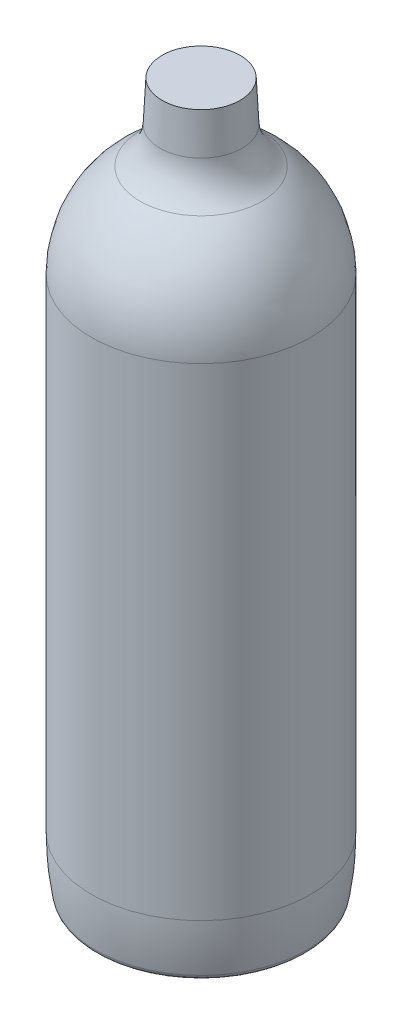
ISO-10303-21;
HEADER;
FILE_DESCRIPTION(('STEP AP214'),'2;1');
FILE_NAME('part.step','',(''),(''),'','','');
FILE_SCHEMA(('AUTOMOTIVE_DESIGN { 1 0 10303 214 1 1 1 1 }'));
ENDSEC;
DATA;
#1=APPLICATION_CONTEXT('core data for automotive mechanical design processes');
#2=APPLICATION_PROTOCOL_DEFINITION('international standard','automotive_design',2000,#1);
#3=PRODUCT_CONTEXT('',#1,'mechanical');
#4=PRODUCT('Part','Part','',(#3));
#5=PRODUCT_RELATED_PRODUCT_CATEGORY('part','',(#4));
#6=PRODUCT_DEFINITION_FORMATION('','',#4);
#7=PRODUCT_DEFINITION_CONTEXT('part definition',#1,'design');
#8=PRODUCT_DEFINITION('design','',#6,#7);
#9=PRODUCT_DEFINITION_SHAPE('','',#8);
#10=(LENGTH_UNIT() NAMED_UNIT(*) SI_UNIT(.MILLI.,.METRE.));
#11=(NAMED_UNIT(*) PLANE_ANGLE_UNIT() SI_UNIT($,.RADIAN.));
#12=(NAMED_UNIT(*) SI_UNIT($,.STERADIAN.) SOLID_ANGLE_UNIT());
#13=UNCERTAINTY_MEASURE_WITH_UNIT(LENGTH_MEASURE(1.E-05),#10,'distance_accuracy_value','');
#14=(GEOMETRIC_REPRESENTATION_CONTEXT(3) GLOBAL_UNCERTAINTY_ASSIGNED_CONTEXT((#13)) GLOBAL_UNIT_ASSIGNED_CONTEXT((#10,
#11,#12)) REPRESENTATION_CONTEXT('',''));
#15=CARTESIAN_POINT('',(0.,0.,0.));
#16=DIRECTION('',(0.,0.,1.));
#17=DIRECTION('',(1.,0.,0.));
#18=AXIS2_PLACEMENT_3D('',#15,#16,#17);
#19=CARTESIAN_POINT('',(-12.618810270685,231.,0.));
#20=DIRECTION('',(0.,-1.,0.));
#21=DIRECTION('',(0.,0.,-1.));
#22=AXIS2_PLACEMENT_3D('',#19,#20,#21);
#23=PLANE('',#22);
#24=CARTESIAN_POINT('',(0.,231.,0.));
#25=DIRECTION('',(0.,-1.,0.));
#26=DIRECTION('',(0.,0.,-1.));
#27=AXIS2_PLACEMENT_3D('',#24,#25,#26);
#28=CIRCLE('',#27,12.6188102706876);
#29=CARTESIAN_POINT('',(0.,231.,-12.6188102706876));
#30=VERTEX_POINT('',#29);
#31=EDGE_CURVE('E61',#30,#30,#28,.T.);
#32=ORIENTED_EDGE('',*,*,#31,.F.);
#33=EDGE_LOOP('',(#32));
#34=FACE_BOUND('',#33,.T.);
#35=ADVANCED_FACE('F30',(#34),#23,.F.);
#36=CARTESIAN_POINT('',(-2.00000000000001,9.93743884534262,0.));
#37=DIRECTION('',(0.,1.,0.));
#38=DIRECTION('',(0.,0.,1.));
#39=AXIS2_PLACEMENT_3D('',#36,#37,#38);
#40=PLANE('',#39);
#41=CARTESIAN_POINT('',(0.,9.93743884534262,0.));
#42=DIRECTION('',(0.,-1.,0.));
#43=DIRECTION('',(0.,0.,-1.));
#44=AXIS2_PLACEMENT_3D('',#41,#42,#43);
#45=CIRCLE('',#44,2.00000000000001);
#46=CARTESIAN_POINT('',(-1.99999999999999,9.93743884534263,0.));
#47=VERTEX_POINT('',#46);
#48=EDGE_CURVE('E10',#47,#47,#45,.T.);
#49=ORIENTED_EDGE('',*,*,#48,.T.);
#50=EDGE_LOOP('',(#49));
#51=FACE_BOUND('',#50,.T.);
#52=ADVANCED_FACE('F68',(#51),#40,.F.);
#53=CARTESIAN_POINT('',(0.,-22.,0.));
#54=DIRECTION('',(0.,-1.,0.));
#55=DIRECTION('',(-1.,0.,0.));
#56=AXIS2_PLACEMENT_3D('',#53,#54,#55);
#57=SPHERICAL_SURFACE('',#56,32.);
#58=CARTESIAN_POINT('',(0.,8.69573486026913,0.));
#59=DIRECTION('',(0.,-1.,0.));
#60=DIRECTION('',(0.,0.,-1.));
#61=AXIS2_PLACEMENT_3D('',#58,#59,#60);
#62=CIRCLE('',#61,9.04277951672265);
#63=CARTESIAN_POINT('',(-9.04277951672264,8.69573486026913,0.));
#64=VERTEX_POINT('',#63);
#65=EDGE_CURVE('E36',#64,#64,#62,.T.);
#66=CARTESIAN_POINT('',(-1.99999999999999,9.93743884534263,0.));
#67=CARTESIAN_POINT('',(-2.0745037428734,9.93277324458954,0.));
#68=CARTESIAN_POINT('',(-2.14899115922238,9.9278469310397,0.));
#69=CARTESIAN_POINT('',(-2.29792969206511,9.9174731397563,0.));
#70=CARTESIAN_POINT('',(-2.37238080855886,9.91202566202274,0.));
#71=CARTESIAN_POINT('',(-2.52124309488477,9.90060980378172,0.));
#72=CARTESIAN_POINT('',(-2.59565426471693,9.89464142327424,0.));
#73=CARTESIAN_POINT('',(-2.74443301334618,9.88218405324716,0.));
#74=CARTESIAN_POINT('',(-2.81880059214325,9.87569506372756,0.));
#75=CARTESIAN_POINT('',(-2.96748851633618,9.86219679310352,0.));
#76=CARTESIAN_POINT('',(-3.04180886173202,9.85518751199909,0.));
#77=CARTESIAN_POINT('',(-3.19039867910388,9.84064900160633,0.));
#78=CARTESIAN_POINT('',(-3.26466815107989,9.83311977231801,0.));
#79=CARTESIAN_POINT('',(-3.41315258407602,9.81754173429261,0.));
#80=CARTESIAN_POINT('',(-3.48736754509612,9.80949292555553,0.));
#81=CARTESIAN_POINT('',(-3.63573932131659,9.79287612285072,0.));
#82=CARTESIAN_POINT('',(-3.70989613651695,9.78430812888298,0.));
#83=CARTESIAN_POINT('',(-3.8581479890813,9.7666533753539,0.));
#84=CARTESIAN_POINT('',(-3.93224302644528,9.75756661579256,0.));
#85=CARTESIAN_POINT('',(-4.08036769434611,9.73887477612372,0.));
#86=CARTESIAN_POINT('',(-4.15439732488296,9.72926969601621,0.));
#87=CARTESIAN_POINT('',(-4.3023875533422,9.70954168568784,0.));
#88=CARTESIAN_POINT('',(-4.37634815126459,9.69941875546697,0.));
#89=CARTESIAN_POINT('',(-4.52419669208866,9.67865554070788,0.));
#90=CARTESIAN_POINT('',(-4.59808463499033,9.66801525616965,0.));
#91=CARTESIAN_POINT('',(-4.74578424692513,9.64621785391052,0.));
#92=CARTESIAN_POINT('',(-4.81959591595826,9.63506073618962,0.));
#93=CARTESIAN_POINT('',(-4.96713936504387,9.61223021401304,0.));
#94=CARTESIAN_POINT('',(-5.04087114509636,9.60055680955737,0.));
#95=CARTESIAN_POINT('',(-5.18825120502136,9.57669428564558,0.));
#96=CARTESIAN_POINT('',(-5.26189948489387,9.56450516618947,0.));
#97=CARTESIAN_POINT('',(-5.40910893734919,9.53961180926958,0.));
#98=CARTESIAN_POINT('',(-5.482670109932,9.5269075718058,0.));
#99=CARTESIAN_POINT('',(-5.62970174496452,9.50098460109257,0.));
#100=CARTESIAN_POINT('',(-5.70317220741423,9.48776586784311,0.));
#101=CARTESIAN_POINT('',(-5.85001882377989,9.46081455297922,0.));
#102=CARTESIAN_POINT('',(-5.92339497769584,9.44708197136478,0.));
#103=CARTESIAN_POINT('',(-6.07004938321232,9.41910363235864,0.));
#104=CARTESIAN_POINT('',(-6.14332763481286,9.40485787496693,0.));
#105=CARTESIAN_POINT('',(-6.28978264671186,9.37585388212806,0.));
#106=CARTESIAN_POINT('',(-6.36295940701034,9.36109564668088,0.));
#107=CARTESIAN_POINT('',(-6.50920785228937,9.33106742055275,0.));
#108=CARTESIAN_POINT('',(-6.58227953726993,9.3157974298718,0.));
#109=CARTESIAN_POINT('',(-6.72831425304362,9.28474644116232,0.));
#110=CARTESIAN_POINT('',(-6.80127728383674,9.26896544313379,0.));
#111=CARTESIAN_POINT('',(-6.94709111768762,9.23689321264317,0.));
#112=CARTESIAN_POINT('',(-7.01994192074538,9.22060198018109,0.));
#113=CARTESIAN_POINT('',(-7.1655277310743,9.18751007872759,0.));
#114=CARTESIAN_POINT('',(-7.23826273834546,9.17070940973617,0.));
#115=CARTESIAN_POINT('',(-7.38361339472115,9.1365994580785,0.));
#116=CARTESIAN_POINT('',(-7.45622904382568,9.11929017541225,0.));
#117=CARTESIAN_POINT('',(-7.60133742733463,9.08416384417246,0.));
#118=CARTESIAN_POINT('',(-7.67383016173905,9.06634679559894,0.));
#119=CARTESIAN_POINT('',(-7.81868916533177,9.0302058051722,0.));
#120=CARTESIAN_POINT('',(-7.89105543452006,9.01188186331899,0.));
#121=CARTESIAN_POINT('',(-8.0356579633682,8.97472798382079,0.));
#122=CARTESIAN_POINT('',(-8.10789422302805,8.95589804617581,0.));
#123=CARTESIAN_POINT('',(-8.25223319483811,8.91773309723765,0.));
#124=CARTESIAN_POINT('',(-8.32433590698833,8.89839808594446,0.));
#125=CARTESIAN_POINT('',(-8.46840425247461,8.85922393706384,0.));
#126=CARTESIAN_POINT('',(-8.54036988581067,8.83938479947641,0.));
#127=CARTESIAN_POINT('',(-8.68416054857106,8.79920336828631,0.));
#128=CARTESIAN_POINT('',(-8.75598557799539,8.77886107468364,0.));
#129=CARTESIAN_POINT('',(-8.89949151661257,8.73767433297544,0.));
#130=CARTESIAN_POINT('',(-8.97117242580542,8.71682988486991,0.));
#131=CARTESIAN_POINT('',(-9.04277951672264,8.69573486026913,0.));
#132=B_SPLINE_CURVE_WITH_KNOTS('',3,(#66,#67,#68,#69,#70,#71,#72,#73,#74,#75,#76,#77,#78,#79,
#80,#81,#82,#83,#84,#85,#86,#87,#88,#89,#90,#91,#92,#93,#94,#95,#96,#97,#98,#99,#100,#101,#102,
#103,#104,#105,#106,#107,#108,#109,#110,#111,#112,#113,#114,#115,#116,#117,#118,#119,#120,#121,
#122,#123,#124,#125,#126,#127,#128,#129,#130,#131),.UNSPECIFIED.,.F.,.F.,(4,2,2,2,2,2,2,2,2,2,2,
2,2,2,2,2,2,2,2,2,2,2,2,2,2,2,2,2,2,2,2,2,4),(0.,0.223948599129949,0.447897198259898,
0.671845797389847,0.895794396519796,1.11974299564975,1.3436915947797,1.56764019390965,
1.7915887930396,2.01553739216955,2.2394859912995,2.46343459042944,2.6873831895594,
2.91133178868935,3.1352803878193,3.35922898694925,3.5831775860792,3.80712618520915,
4.03107478433909,4.25502338346904,4.47897198259899,4.70292058172895,4.9268691808589,
5.15081777998884,5.37476637911879,5.59871497824874,5.82266357737869,6.04661217650864,
6.2705607756386,6.49450937476854,6.71845797389849,6.94240657302844,7.16635517215839),.UNSPECIFIED.);
#133=EDGE_CURVE('BSEAM72',#47,#64,#132,.T.);
#134=ORIENTED_EDGE('',*,*,#48,.F.);
#135=ORIENTED_EDGE('',*,*,#65,.T.);
#136=ORIENTED_EDGE('',*,*,#133,.T.);
#137=ORIENTED_EDGE('',*,*,#133,.F.);
#138=EDGE_LOOP('',(#134,#136,#135,#137));
#139=FACE_BOUND('',#138,.T.);
#140=ADVANCED_FACE('F72',(#139),#57,.F.);
#141=CARTESIAN_POINT('',(0.,2.08151657123318,0.));
#142=DIRECTION('',(0.,-1.,0.));
#143=DIRECTION('',(0.,0.,-1.));
#144=AXIS2_PLACEMENT_3D('',#141,#142,#143);
#145=CONICAL_SURFACE('',#144,31.4947579745335,1.28430650884736);
#146=ORIENTED_EDGE('',*,*,#65,.F.);
#147=EDGE_LOOP('',(#146));
#148=FACE_BOUND('',#147,.T.);
#149=CARTESIAN_POINT('',(0.,2.08151657123318,0.));
#150=DIRECTION('',(0.,-1.,0.));
#151=DIRECTION('',(0.,0.,-1.));
#152=AXIS2_PLACEMENT_3D('',#149,#150,#151);
#153=CIRCLE('',#152,31.4947579745335);
#154=CARTESIAN_POINT('',(0.,2.08151657123318,-31.4947579745335));
#155=VERTEX_POINT('',#154);
#156=EDGE_CURVE('E40',#155,#155,#153,.T.);
#157=ORIENTED_EDGE('',*,*,#156,.T.);
#158=EDGE_LOOP('',(#157));
#159=FACE_BOUND('',#158,.T.);
#160=ADVANCED_FACE('F76',(#148,#159),#145,.F.);
#161=CARTESIAN_POINT('',(0.,4.,0.));
#162=DIRECTION('',(0.,-1.,0.));
#163=DIRECTION('',(0.,0.,-1.));
#164=AXIS2_PLACEMENT_3D('',#161,#162,#163);
#165=TOROIDAL_SURFACE('',#164,32.0599316943287,2.);
#166=ORIENTED_EDGE('',*,*,#156,.F.);
#167=EDGE_LOOP('',(#166));
#168=FACE_BOUND('',#167,.T.);
#169=CARTESIAN_POINT('',(0.,3.65508633448191,0.));
#170=DIRECTION('',(0.,-1.,0.));
#171=DIRECTION('',(0.,0.,-1.));
#172=AXIS2_PLACEMENT_3D('',#169,#170,#171);
#173=CIRCLE('',#172,34.0299658471643);
#174=CARTESIAN_POINT('',(0.,3.65508633448191,-34.0299658471643));
#175=VERTEX_POINT('',#174);
#176=EDGE_CURVE('E44',#175,#175,#173,.T.);
#177=ORIENTED_EDGE('',*,*,#176,.T.);
#178=EDGE_LOOP('',(#177));
#179=FACE_BOUND('',#178,.T.);
#180=ADVANCED_FACE('F82',(#168,#179),#165,.T.);
#181=CARTESIAN_POINT('',(0.,20.,0.));
#182=DIRECTION('',(0.,-1.,0.));
#183=DIRECTION('',(0.,0.,-1.));
#184=AXIS2_PLACEMENT_3D('',#181,#182,#183);
#185=DEGENERATE_TOROIDAL_SURFACE('',#184,59.3268401171732,94.7768401171732,.F.);
#186=ORIENTED_EDGE('',*,*,#176,.F.);
#187=EDGE_LOOP('',(#186));
#188=FACE_BOUND('',#187,.T.);
#189=CARTESIAN_POINT('',(0.,20.,0.));
#190=DIRECTION('',(0.,-1.,0.));
#191=DIRECTION('',(0.,0.,-1.));
#192=AXIS2_PLACEMENT_3D('',#189,#190,#191);
#193=CIRCLE('',#192,35.45);
#194=CARTESIAN_POINT('',(0.,20.,-35.45));
#195=VERTEX_POINT('',#194);
#196=EDGE_CURVE('E49',#195,#195,#193,.T.);
#197=ORIENTED_EDGE('',*,*,#196,.T.);
#198=EDGE_LOOP('',(#197));
#199=FACE_BOUND('',#198,.T.);
#200=ADVANCED_FACE('F86',(#188,#199),#185,.F.);
#201=CARTESIAN_POINT('',(0.,0.,0.));
#202=DIRECTION('',(0.,-1.,0.));
#203=DIRECTION('',(0.,0.,-1.));
#204=AXIS2_PLACEMENT_3D('',#201,#202,#203);
#205=CYLINDRICAL_SURFACE('',#204,35.45);
#206=ORIENTED_EDGE('',*,*,#196,.F.);
#207=EDGE_LOOP('',(#206));
#208=FACE_BOUND('',#207,.T.);
#209=CARTESIAN_POINT('',(0.,176.,0.));
#210=DIRECTION('',(0.,-1.,0.));
#211=DIRECTION('',(0.,0.,-1.));
#212=AXIS2_PLACEMENT_3D('',#209,#210,#211);
#213=CIRCLE('',#212,35.45);
#214=CARTESIAN_POINT('',(0.,176.,-35.45));
#215=VERTEX_POINT('',#214);
#216=EDGE_CURVE('E52',#215,#215,#213,.T.);
#217=ORIENTED_EDGE('',*,*,#216,.T.);
#218=EDGE_LOOP('',(#217));
#219=FACE_BOUND('',#218,.T.);
#220=ADVANCED_FACE('F90',(#208,#219),#205,.T.);
#221=CARTESIAN_POINT('',(0.,176.,0.));
#222=DIRECTION('',(0.,-1.,0.));
#223=DIRECTION('',(0.,0.,-1.));
#224=AXIS2_PLACEMENT_3D('',#221,#222,#223);
#225=DEGENERATE_TOROIDAL_SURFACE('',#224,1.55,37.,.F.);
#226=ORIENTED_EDGE('',*,*,#216,.F.);
#227=EDGE_LOOP('',(#226));
#228=FACE_BOUND('',#227,.T.);
#229=CARTESIAN_POINT('',(0.,206.273885742481,0.));
#230=DIRECTION('',(0.,-1.,0.));
#231=DIRECTION('',(0.,0.,-1.));
#232=AXIS2_PLACEMENT_3D('',#229,#230,#231);
#233=CIRCLE('',#232,19.7218556325304);
#234=CARTESIAN_POINT('',(0.,206.273885742481,-19.7218556325304));
#235=VERTEX_POINT('',#234);
#236=EDGE_CURVE('E55',#235,#235,#233,.T.);
#237=ORIENTED_EDGE('',*,*,#236,.T.);
#238=EDGE_LOOP('',(#237));
#239=FACE_BOUND('',#238,.T.);
#240=ADVANCED_FACE('F94',(#228,#239),#225,.F.);
#241=CARTESIAN_POINT('',(0.,218.774583303086,0.));
#242=DIRECTION('',(0.,-1.,0.));
#243=DIRECTION('',(0.,0.,-1.));
#244=AXIS2_PLACEMENT_3D('',#241,#242,#243);
#245=TOROIDAL_SURFACE('',#244,28.5054335345261,15.2780456951167);
#246=ORIENTED_EDGE('',*,*,#236,.F.);
#247=EDGE_LOOP('',(#246));
#248=FACE_BOUND('',#247,.T.);
#249=CARTESIAN_POINT('',(0.,217.883328718567,0.));
#250=DIRECTION('',(0.,-1.,0.));
#251=DIRECTION('',(0.,0.,-1.));
#252=AXIS2_PLACEMENT_3D('',#249,#250,#251);
#253=CIRCLE('',#252,13.2534059470986);
#254=CARTESIAN_POINT('',(0.,217.883328718567,-13.2534059470986));
#255=VERTEX_POINT('',#254);
#256=EDGE_CURVE('E58',#255,#255,#253,.T.);
#257=ORIENTED_EDGE('',*,*,#256,.T.);
#258=EDGE_LOOP('',(#257));
#259=FACE_BOUND('',#258,.T.);
#260=ADVANCED_FACE('F98',(#248,#259),#245,.F.);
#261=CARTESIAN_POINT('',(0.,256.089285714286,0.));
#262=DIRECTION('',(0.,-1.,0.));
#263=DIRECTION('',(0.,0.,-1.));
#264=AXIS2_PLACEMENT_3D('',#261,#262,#263);
#265=TOROIDAL_SURFACE('',#264,667.07142857143,654.933356806898);
#266=ORIENTED_EDGE('',*,*,#256,.F.);
#267=EDGE_LOOP('',(#266));
#268=FACE_BOUND('',#267,.T.);
#269=ORIENTED_EDGE('',*,*,#31,.T.);
#270=EDGE_LOOP('',(#269));
#271=FACE_BOUND('',#270,.T.);
#272=ADVANCED_FACE('F65',(#268,#271),#265,.F.);
#273=CLOSED_SHELL('',(#35,#52,#140,#160,#180,#200,#220,#240,#260,#272));
#274=MANIFOLD_SOLID_BREP('B2',#273);
#275=ADVANCED_BREP_SHAPE_REPRESENTATION('',(#18,#274),#14);
#276=SHAPE_DEFINITION_REPRESENTATION(#9,#275);
ENDSEC;
END-ISO-10303-21;
